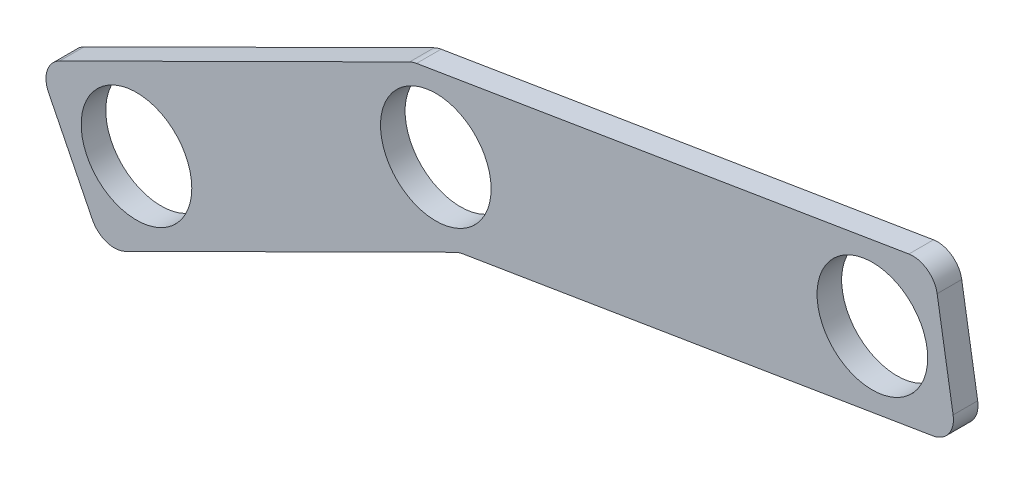
ISO-10303-21;
HEADER;
FILE_DESCRIPTION(('STEP AP214'),'2;1');
FILE_NAME('part.step','',(''),(''),'','','');
FILE_SCHEMA(('AUTOMOTIVE_DESIGN { 1 0 10303 214 1 1 1 1 }'));
ENDSEC;
DATA;
#1=APPLICATION_CONTEXT('core data for automotive mechanical design processes');
#2=APPLICATION_PROTOCOL_DEFINITION('international standard','automotive_design',2000,#1);
#3=PRODUCT_CONTEXT('',#1,'mechanical');
#4=PRODUCT('Part','Part','',(#3));
#5=PRODUCT_RELATED_PRODUCT_CATEGORY('part','',(#4));
#6=PRODUCT_DEFINITION_FORMATION('','',#4);
#7=PRODUCT_DEFINITION_CONTEXT('part definition',#1,'design');
#8=PRODUCT_DEFINITION('design','',#6,#7);
#9=PRODUCT_DEFINITION_SHAPE('','',#8);
#10=(LENGTH_UNIT() NAMED_UNIT(*) SI_UNIT(.MILLI.,.METRE.));
#11=(NAMED_UNIT(*) PLANE_ANGLE_UNIT() SI_UNIT($,.RADIAN.));
#12=(NAMED_UNIT(*) SI_UNIT($,.STERADIAN.) SOLID_ANGLE_UNIT());
#13=UNCERTAINTY_MEASURE_WITH_UNIT(LENGTH_MEASURE(1.E-05),#10,'distance_accuracy_value','');
#14=(GEOMETRIC_REPRESENTATION_CONTEXT(3) GLOBAL_UNCERTAINTY_ASSIGNED_CONTEXT((#13)) GLOBAL_UNIT_ASSIGNED_CONTEXT((#10,
#11,#12)) REPRESENTATION_CONTEXT('',''));
#15=CARTESIAN_POINT('',(0.,0.,0.));
#16=DIRECTION('',(0.,0.,1.));
#17=DIRECTION('',(1.,0.,0.));
#18=AXIS2_PLACEMENT_3D('',#15,#16,#17);
#19=CARTESIAN_POINT('',(-41.924554425237,254.568098691387,3.175));
#20=DIRECTION('',(0.162500000001426,-0.986708543593059,0.));
#21=DIRECTION('',(0.986708543593059,0.162500000001426,0.));
#22=AXIS2_PLACEMENT_3D('',#19,#20,#21);
#23=PLANE('',#22);
#24=DIRECTION('',(-0.98670854359306,-0.162500000001426,0.));
#25=VECTOR('',#24,1.);
#26=CARTESIAN_POINT('',(-41.924554425237,254.568098691387,-3.175));
#27=LINE('',#26,#25);
#28=CARTESIAN_POINT('',(678.196795385294,373.164132043968,-3.175));
#29=VERTEX_POINT('',#28);
#30=CARTESIAN_POINT('',(551.000523764214,352.216310853183,-3.175));
#31=VERTEX_POINT('',#30);
#32=EDGE_CURVE('E232',#29,#31,#27,.T.);
#33=ORIENTED_EDGE('',*,*,#32,.T.);
#34=DIRECTION('',(0.,0.,-1.));
#35=VECTOR('',#34,1.);
#36=CARTESIAN_POINT('',(551.000523764214,352.216310853183,3.175));
#37=LINE('',#36,#35);
#38=CARTESIAN_POINT('',(551.000523764214,352.216310853183,3.175));
#39=VERTEX_POINT('',#38);
#40=EDGE_CURVE('E201',#31,#39,#37,.F.);
#41=ORIENTED_EDGE('',*,*,#40,.T.);
#42=DIRECTION('',(-0.98670854359306,-0.162500000001426,0.));
#43=VECTOR('',#42,1.);
#44=CARTESIAN_POINT('',(-41.924554425237,254.568098691387,3.175));
#45=LINE('',#44,#43);
#46=CARTESIAN_POINT('',(678.196795385294,373.164132043968,3.175));
#47=VERTEX_POINT('',#46);
#48=EDGE_CURVE('E436',#47,#39,#45,.T.);
#49=ORIENTED_EDGE('',*,*,#48,.F.);
#50=DIRECTION('',(0.,0.,-1.));
#51=VECTOR('',#50,1.);
#52=CARTESIAN_POINT('',(678.196795385294,373.164132043968,3.175));
#53=LINE('',#52,#51);
#54=EDGE_CURVE('E198',#47,#29,#53,.T.);
#55=ORIENTED_EDGE('',*,*,#54,.T.);
#56=EDGE_LOOP('',(#33,#41,#49,#55));
#57=FACE_BOUND('',#56,.T.);
#58=ADVANCED_FACE('F39',(#57),#23,.F.);
#59=CARTESIAN_POINT('',(-31.2509469730069,62.8038273467465,3.175));
#60=DIRECTION('',(0.445491108516483,-0.895286363256335,0.));
#61=DIRECTION('',(0.895286363256335,0.445491108516483,0.));
#62=AXIS2_PLACEMENT_3D('',#59,#60,#61);
#63=PLANE('',#62);
#64=DIRECTION('',(-0.895286363256335,-0.445491108516483,0.));
#65=VECTOR('',#64,1.);
#66=CARTESIAN_POINT('',(-31.2509469730069,62.8038273467465,-3.175));
#67=LINE('',#66,#65);
#68=CARTESIAN_POINT('',(549.203530225143,351.635780008045,-3.175));
#69=VERTEX_POINT('',#68);
#70=CARTESIAN_POINT('',(458.798402644837,306.650530422831,-3.175));
#71=VERTEX_POINT('',#70);
#72=EDGE_CURVE('E235',#69,#71,#67,.T.);
#73=ORIENTED_EDGE('',*,*,#72,.T.);
#74=DIRECTION('',(0.,0.,-1.));
#75=VECTOR('',#74,1.);
#76=CARTESIAN_POINT('',(458.798402644837,306.650530422831,3.175));
#77=LINE('',#76,#75);
#78=CARTESIAN_POINT('',(458.798402644837,306.650530422831,3.175));
#79=VERTEX_POINT('',#78);
#80=EDGE_CURVE('E196',#71,#79,#77,.F.);
#81=ORIENTED_EDGE('',*,*,#80,.T.);
#82=DIRECTION('',(-0.895286363256335,-0.445491108516483,0.));
#83=VECTOR('',#82,1.);
#84=CARTESIAN_POINT('',(-31.2509469730069,62.8038273467465,3.175));
#85=LINE('',#84,#83);
#86=CARTESIAN_POINT('',(549.203530225143,351.635780008045,3.175));
#87=VERTEX_POINT('',#86);
#88=EDGE_CURVE('E439',#87,#79,#85,.T.);
#89=ORIENTED_EDGE('',*,*,#88,.F.);
#90=DIRECTION('',(0.,0.,-1.));
#91=VECTOR('',#90,1.);
#92=CARTESIAN_POINT('',(549.203530225143,351.635780008045,3.175));
#93=LINE('',#92,#91);
#94=EDGE_CURVE('E193',#87,#69,#93,.T.);
#95=ORIENTED_EDGE('',*,*,#94,.T.);
#96=EDGE_LOOP('',(#73,#81,#89,#95));
#97=FACE_BOUND('',#96,.T.);
#98=ADVANCED_FACE('F259',(#97),#63,.F.);
#99=CARTESIAN_POINT('',(484.364281211167,241.017834537005,3.175));
#100=DIRECTION('',(0.895286363256335,0.445491108516483,0.));
#101=DIRECTION('',(-0.445491108516483,0.895286363256336,0.));
#102=AXIS2_PLACEMENT_3D('',#99,#100,#101);
#103=PLANE('',#102);
#104=DIRECTION('',(0.445491108516483,-0.895286363256336,0.));
#105=VECTOR('',#104,1.);
#106=CARTESIAN_POINT('',(484.364281211167,241.017834537005,-3.175));
#107=LINE('',#106,#105);
#108=CARTESIAN_POINT('',(455.942202777239,298.136593477074,-3.175));
#109=VERTEX_POINT('',#108);
#110=CARTESIAN_POINT('',(467.257676933558,275.396319850363,-3.175));
#111=VERTEX_POINT('',#110);
#112=EDGE_CURVE('E207',#109,#111,#107,.T.);
#113=ORIENTED_EDGE('',*,*,#112,.T.);
#114=DIRECTION('',(0.,0.,-1.));
#115=VECTOR('',#114,1.);
#116=CARTESIAN_POINT('',(467.257676933558,275.396319850363,3.175));
#117=LINE('',#116,#115);
#118=CARTESIAN_POINT('',(467.257676933558,275.396319850363,3.175));
#119=VERTEX_POINT('',#118);
#120=EDGE_CURVE('E191',#111,#119,#117,.F.);
#121=ORIENTED_EDGE('',*,*,#120,.T.);
#122=DIRECTION('',(0.445491108516483,-0.895286363256336,0.));
#123=VECTOR('',#122,1.);
#124=CARTESIAN_POINT('',(484.364281211167,241.017834537005,3.175));
#125=LINE('',#124,#123);
#126=CARTESIAN_POINT('',(455.942202777239,298.136593477074,3.175));
#127=VERTEX_POINT('',#126);
#128=EDGE_CURVE('E219',#127,#119,#125,.T.);
#129=ORIENTED_EDGE('',*,*,#128,.F.);
#130=DIRECTION('',(0.,0.,-1.));
#131=VECTOR('',#130,1.);
#132=CARTESIAN_POINT('',(455.942202777239,298.136593477074,3.175));
#133=LINE('',#132,#131);
#134=EDGE_CURVE('E188',#127,#109,#133,.T.);
#135=ORIENTED_EDGE('',*,*,#134,.T.);
#136=EDGE_LOOP('',(#113,#121,#129,#135));
#137=FACE_BOUND('',#136,.T.);
#138=ADVANCED_FACE('F242',(#137),#103,.F.);
#139=CARTESIAN_POINT('',(-14.2777357385289,28.6934169066803,3.175));
#140=DIRECTION('',(-0.445491108516483,0.895286363256335,0.));
#141=DIRECTION('',(-0.895286363256335,-0.445491108516483,0.));
#142=AXIS2_PLACEMENT_3D('',#139,#140,#141);
#143=PLANE('',#142);
#144=DIRECTION('',(0.895286363256336,0.445491108516483,0.));
#145=VECTOR('',#144,1.);
#146=CARTESIAN_POINT('',(-14.2777357385289,28.6934169066803,-3.175));
#147=LINE('',#146,#145);
#148=CARTESIAN_POINT('',(475.771613879315,272.540119982765,-3.175));
#149=VERTEX_POINT('',#148);
#150=CARTESIAN_POINT('',(561.047639979481,314.973148068959,-3.175));
#151=VERTEX_POINT('',#150);
#152=EDGE_CURVE('E161',#149,#151,#147,.T.);
#153=ORIENTED_EDGE('',*,*,#152,.T.);
#154=DIRECTION('',(0.,0.,-1.));
#155=VECTOR('',#154,1.);
#156=CARTESIAN_POINT('',(561.047639979481,314.973148068959,3.175));
#157=LINE('',#156,#155);
#158=CARTESIAN_POINT('',(561.047639979481,314.973148068959,3.175));
#159=VERTEX_POINT('',#158);
#160=EDGE_CURVE('E54',#151,#159,#157,.F.);
#161=ORIENTED_EDGE('',*,*,#160,.T.);
#162=DIRECTION('',(0.895286363256336,0.445491108516483,0.));
#163=VECTOR('',#162,1.);
#164=CARTESIAN_POINT('',(-14.2777357385289,28.6934169066803,3.175));
#165=LINE('',#164,#163);
#166=CARTESIAN_POINT('',(475.771613879315,272.540119982765,3.175));
#167=VERTEX_POINT('',#166);
#168=EDGE_CURVE('E214',#167,#159,#165,.T.);
#169=ORIENTED_EDGE('',*,*,#168,.F.);
#170=DIRECTION('',(0.,0.,-1.));
#171=VECTOR('',#170,1.);
#172=CARTESIAN_POINT('',(475.771613879315,272.540119982765,3.175));
#173=LINE('',#172,#171);
#174=EDGE_CURVE('E184',#167,#149,#173,.T.);
#175=ORIENTED_EDGE('',*,*,#174,.T.);
#176=EDGE_LOOP('',(#153,#161,#169,#175));
#177=FACE_BOUND('',#176,.T.);
#178=ADVANCED_FACE('F205',(#177),#143,.F.);
#179=CARTESIAN_POINT('',(-35.7333044251826,216.974503180492,3.175));
#180=DIRECTION('',(-0.162500000001426,0.986708543593059,0.));
#181=DIRECTION('',(-0.98670854359306,-0.162500000001426,0.));
#182=AXIS2_PLACEMENT_3D('',#179,#180,#181);
#183=PLANE('',#182);
#184=DIRECTION('',(0.986708543593059,0.162500000001426,0.));
#185=VECTOR('',#184,1.);
#186=CARTESIAN_POINT('',(-35.7333044251826,216.974503180492,-3.175));
#187=LINE('',#186,#185);
#188=CARTESIAN_POINT('',(562.844633518552,315.553678914098,-3.175));
#189=VERTEX_POINT('',#188);
#190=CARTESIAN_POINT('',(684.388045385348,335.570536533072,-3.175));
#191=VERTEX_POINT('',#190);
#192=EDGE_CURVE('E156',#189,#191,#187,.T.);
#193=ORIENTED_EDGE('',*,*,#192,.T.);
#194=DIRECTION('',(0.,0.,-1.));
#195=VECTOR('',#194,1.);
#196=CARTESIAN_POINT('',(684.388045385348,335.570536533072,3.175));
#197=LINE('',#196,#195);
#198=CARTESIAN_POINT('',(684.388045385348,335.570536533072,3.175));
#199=VERTEX_POINT('',#198);
#200=EDGE_CURVE('E134',#191,#199,#197,.F.);
#201=ORIENTED_EDGE('',*,*,#200,.T.);
#202=DIRECTION('',(0.986708543593059,0.162500000001426,0.));
#203=VECTOR('',#202,1.);
#204=CARTESIAN_POINT('',(-35.7333044251826,216.974503180492,3.175));
#205=LINE('',#204,#203);
#206=CARTESIAN_POINT('',(562.844633518552,315.553678914098,3.175));
#207=VERTEX_POINT('',#206);
#208=EDGE_CURVE('E213',#207,#199,#205,.T.);
#209=ORIENTED_EDGE('',*,*,#208,.F.);
#210=DIRECTION('',(0.,0.,-1.));
#211=VECTOR('',#210,1.);
#212=CARTESIAN_POINT('',(562.844633518551,315.553678914098,-3.175));
#213=LINE('',#212,#211);
#214=EDGE_CURVE('E139',#207,#189,#213,.T.);
#215=ORIENTED_EDGE('',*,*,#214,.T.);
#216=EDGE_LOOP('',(#193,#201,#209,#215));
#217=FACE_BOUND('',#216,.T.);
#218=ADVANCED_FACE('F216',(#217),#183,.F.);
#219=CARTESIAN_POINT('',(668.761221881689,352.303584288502,3.175));
#220=DIRECTION('',(0.,0.,-1.));
#221=DIRECTION('',(-1.,0.,0.));
#222=AXIS2_PLACEMENT_3D('',#219,#220,#221);
#223=CYLINDRICAL_SURFACE('',#222,14.2875);
#224=CARTESIAN_POINT('',(668.761221881689,352.303584288502,3.175));
#225=DIRECTION('',(0.,0.,1.));
#226=DIRECTION('',(1.,0.,0.));
#227=AXIS2_PLACEMENT_3D('',#224,#225,#226);
#228=CIRCLE('',#227,14.2875);
#229=CARTESIAN_POINT('',(683.048721881689,352.303584288502,3.175));
#230=VERTEX_POINT('',#229);
#231=EDGE_CURVE('E440',#230,#230,#228,.T.);
#232=ORIENTED_EDGE('',*,*,#231,.T.);
#233=EDGE_LOOP('',(#232));
#234=FACE_BOUND('',#233,.T.);
#235=CARTESIAN_POINT('',(668.761221881689,352.303584288502,-3.175));
#236=DIRECTION('',(0.,0.,1.));
#237=DIRECTION('',(1.,0.,0.));
#238=AXIS2_PLACEMENT_3D('',#235,#236,#237);
#239=CIRCLE('',#238,14.2875);
#240=CARTESIAN_POINT('',(683.048721881689,352.303584288502,-3.175));
#241=VERTEX_POINT('',#240);
#242=EDGE_CURVE('E229',#241,#241,#239,.T.);
#243=ORIENTED_EDGE('',*,*,#242,.F.);
#244=EDGE_LOOP('',(#243));
#245=FACE_BOUND('',#244,.T.);
#246=ADVANCED_FACE('F269',(#234,#245),#223,.F.);
#247=CARTESIAN_POINT('',(555.980435349002,333.729834288339,3.175));
#248=DIRECTION('',(0.,0.,-1.));
#249=DIRECTION('',(-1.,0.,0.));
#250=AXIS2_PLACEMENT_3D('',#247,#248,#249);
#251=CYLINDRICAL_SURFACE('',#250,14.2875);
#252=CARTESIAN_POINT('',(555.980435349002,333.729834288339,3.175));
#253=DIRECTION('',(0.,0.,1.));
#254=DIRECTION('',(1.,0.,0.));
#255=AXIS2_PLACEMENT_3D('',#252,#253,#254);
#256=CIRCLE('',#255,14.2875);
#257=CARTESIAN_POINT('',(570.267935349002,333.729834288339,3.175));
#258=VERTEX_POINT('',#257);
#259=EDGE_CURVE('E159',#258,#258,#256,.T.);
#260=ORIENTED_EDGE('',*,*,#259,.T.);
#261=EDGE_LOOP('',(#260));
#262=FACE_BOUND('',#261,.T.);
#263=CARTESIAN_POINT('',(555.980435349002,333.729834288339,-3.175));
#264=DIRECTION('',(0.,0.,1.));
#265=DIRECTION('',(1.,0.,0.));
#266=AXIS2_PLACEMENT_3D('',#263,#264,#265);
#267=CIRCLE('',#266,14.2875);
#268=CARTESIAN_POINT('',(570.267935349002,333.729834288339,-3.175));
#269=VERTEX_POINT('',#268);
#270=EDGE_CURVE('E226',#269,#269,#267,.T.);
#271=ORIENTED_EDGE('',*,*,#270,.F.);
#272=EDGE_LOOP('',(#271));
#273=FACE_BOUND('',#272,.T.);
#274=ADVANCED_FACE('F272',(#262,#273),#251,.F.);
#275=CARTESIAN_POINT('',(478.655145075432,295.253062280957,3.175));
#276=DIRECTION('',(0.,0.,-1.));
#277=DIRECTION('',(-1.,0.,0.));
#278=AXIS2_PLACEMENT_3D('',#275,#276,#277);
#279=CYLINDRICAL_SURFACE('',#278,14.2875);
#280=CARTESIAN_POINT('',(478.655145075432,295.253062280957,3.175));
#281=DIRECTION('',(0.,0.,1.));
#282=DIRECTION('',(1.,0.,0.));
#283=AXIS2_PLACEMENT_3D('',#280,#281,#282);
#284=CIRCLE('',#283,14.2875);
#285=CARTESIAN_POINT('',(492.942645075432,295.253062280957,3.175));
#286=VERTEX_POINT('',#285);
#287=EDGE_CURVE('E155',#286,#286,#284,.T.);
#288=ORIENTED_EDGE('',*,*,#287,.T.);
#289=EDGE_LOOP('',(#288));
#290=FACE_BOUND('',#289,.T.);
#291=CARTESIAN_POINT('',(478.655145075432,295.253062280957,-3.175));
#292=DIRECTION('',(0.,0.,1.));
#293=DIRECTION('',(1.,0.,0.));
#294=AXIS2_PLACEMENT_3D('',#291,#292,#293);
#295=CIRCLE('',#294,14.2875);
#296=CARTESIAN_POINT('',(492.942645075432,295.253062280957,-3.175));
#297=VERTEX_POINT('',#296);
#298=EDGE_CURVE('E223',#297,#297,#295,.T.);
#299=ORIENTED_EDGE('',*,*,#298,.F.);
#300=EDGE_LOOP('',(#299));
#301=FACE_BOUND('',#300,.T.);
#302=ADVANCED_FACE('F276',(#290,#301),#279,.F.);
#303=CARTESIAN_POINT('',(726.386949062347,119.62790835259,3.175));
#304=DIRECTION('',(-0.986708543593059,-0.162500000001427,0.));
#305=DIRECTION('',(0.162500000001427,-0.986708543593059,0.));
#306=AXIS2_PLACEMENT_3D('',#303,#304,#305);
#307=PLANE('',#306);
#308=DIRECTION('',(-0.162500000001427,0.986708543593059,0.));
#309=VECTOR('',#308,1.);
#310=CARTESIAN_POINT('',(726.386949062347,119.62790835259,3.175));
#311=LINE('',#310,#309);
#312=CARTESIAN_POINT('',(689.621769637155,342.868010784897,3.175));
#313=VERTEX_POINT('',#312);
#314=CARTESIAN_POINT('',(685.494269637119,367.930407792161,3.175));
#315=VERTEX_POINT('',#314);
#316=EDGE_CURVE('E149',#313,#315,#311,.T.);
#317=ORIENTED_EDGE('',*,*,#316,.F.);
#318=DIRECTION('',(0.,0.,-1.));
#319=VECTOR('',#318,1.);
#320=CARTESIAN_POINT('',(689.621769637155,342.868010784897,3.175));
#321=LINE('',#320,#319);
#322=CARTESIAN_POINT('',(689.621769637155,342.868010784897,-3.175));
#323=VERTEX_POINT('',#322);
#324=EDGE_CURVE('E133',#313,#323,#321,.T.);
#325=ORIENTED_EDGE('',*,*,#324,.T.);
#326=DIRECTION('',(-0.162500000001427,0.986708543593059,0.));
#327=VECTOR('',#326,1.);
#328=CARTESIAN_POINT('',(726.386949062347,119.62790835259,-3.175));
#329=LINE('',#328,#327);
#330=CARTESIAN_POINT('',(685.494269637119,367.930407792161,-3.175));
#331=VERTEX_POINT('',#330);
#332=EDGE_CURVE('E146',#323,#331,#329,.T.);
#333=ORIENTED_EDGE('',*,*,#332,.T.);
#334=DIRECTION('',(0.,0.,-1.));
#335=VECTOR('',#334,1.);
#336=CARTESIAN_POINT('',(685.494269637119,367.930407792161,3.175));
#337=LINE('',#336,#335);
#338=EDGE_CURVE('E151',#331,#315,#337,.F.);
#339=ORIENTED_EDGE('',*,*,#338,.T.);
#340=EDGE_LOOP('',(#317,#325,#333,#339));
#341=FACE_BOUND('',#340,.T.);
#342=ADVANCED_FACE('F145',(#341),#307,.F.);
#343=CARTESIAN_POINT('',(0.,0.,3.175));
#344=DIRECTION('',(0.,0.,1.));
#345=DIRECTION('',(1.,0.,0.));
#346=AXIS2_PLACEMENT_3D('',#343,#344,#345);
#347=PLANE('',#346);
#348=ORIENTED_EDGE('',*,*,#287,.F.);
#349=EDGE_LOOP('',(#348));
#350=FACE_BOUND('',#349,.T.);
#351=ORIENTED_EDGE('',*,*,#259,.F.);
#352=EDGE_LOOP('',(#351));
#353=FACE_BOUND('',#352,.T.);
#354=ORIENTED_EDGE('',*,*,#231,.F.);
#355=EDGE_LOOP('',(#354));
#356=FACE_BOUND('',#355,.T.);
#357=ORIENTED_EDGE('',*,*,#208,.T.);
#358=CARTESIAN_POINT('',(683.356170385339,341.836135784888,3.175));
#359=DIRECTION('',(0.,0.,1.));
#360=DIRECTION('',(1.,0.,0.));
#361=AXIS2_PLACEMENT_3D('',#358,#359,#360);
#362=CIRCLE('',#361,6.35);
#363=EDGE_CURVE('E182',#199,#313,#362,.T.);
#364=ORIENTED_EDGE('',*,*,#363,.T.);
#365=ORIENTED_EDGE('',*,*,#316,.T.);
#366=CARTESIAN_POINT('',(679.228670385303,366.898532792152,3.175));
#367=DIRECTION('',(0.,0.,1.));
#368=DIRECTION('',(1.,0.,0.));
#369=AXIS2_PLACEMENT_3D('',#366,#367,#368);
#370=CIRCLE('',#369,6.35);
#371=EDGE_CURVE('E175',#315,#47,#370,.T.);
#372=ORIENTED_EDGE('',*,*,#371,.T.);
#373=ORIENTED_EDGE('',*,*,#48,.T.);
#374=CARTESIAN_POINT('',(552.032398764223,345.950711601367,3.175));
#375=DIRECTION('',(0.,0.,1.));
#376=DIRECTION('',(1.,0.,0.));
#377=AXIS2_PLACEMENT_3D('',#374,#375,#376);
#378=CIRCLE('',#377,6.35);
#379=EDGE_CURVE('E177',#39,#87,#378,.T.);
#380=ORIENTED_EDGE('',*,*,#379,.T.);
#381=ORIENTED_EDGE('',*,*,#88,.T.);
#382=CARTESIAN_POINT('',(461.627271183917,300.965462016153,3.175));
#383=DIRECTION('',(0.,0.,1.));
#384=DIRECTION('',(1.,0.,0.));
#385=AXIS2_PLACEMENT_3D('',#382,#383,#384);
#386=CIRCLE('',#385,6.35);
#387=EDGE_CURVE('E179',#79,#127,#386,.T.);
#388=ORIENTED_EDGE('',*,*,#387,.T.);
#389=ORIENTED_EDGE('',*,*,#128,.T.);
#390=CARTESIAN_POINT('',(472.942745340236,278.225188389442,3.175));
#391=DIRECTION('',(0.,0.,1.));
#392=DIRECTION('',(1.,0.,0.));
#393=AXIS2_PLACEMENT_3D('',#390,#391,#392);
#394=CIRCLE('',#393,6.35);
#395=EDGE_CURVE('E61',#119,#167,#394,.T.);
#396=ORIENTED_EDGE('',*,*,#395,.T.);
#397=ORIENTED_EDGE('',*,*,#168,.T.);
#398=CARTESIAN_POINT('',(563.87650851856,309.288079662282,3.175));
#399=DIRECTION('',(0.,0.,1.));
#400=DIRECTION('',(1.,0.,0.));
#401=AXIS2_PLACEMENT_3D('',#398,#399,#400);
#402=CIRCLE('',#401,6.35);
#403=EDGE_CURVE('E11',#159,#207,#402,.F.);
#404=ORIENTED_EDGE('',*,*,#403,.T.);
#405=EDGE_LOOP('',(#357,#364,#365,#372,#373,#380,#381,#388,#389,#396,#397,#404));
#406=FACE_BOUND('',#405,.T.);
#407=ADVANCED_FACE('F212',(#350,#353,#356,#406),#347,.T.);
#408=CARTESIAN_POINT('',(0.,0.,-3.175));
#409=DIRECTION('',(0.,0.,1.));
#410=DIRECTION('',(1.,0.,0.));
#411=AXIS2_PLACEMENT_3D('',#408,#409,#410);
#412=PLANE('',#411);
#413=ORIENTED_EDGE('',*,*,#298,.T.);
#414=EDGE_LOOP('',(#413));
#415=FACE_BOUND('',#414,.T.);
#416=ORIENTED_EDGE('',*,*,#270,.T.);
#417=EDGE_LOOP('',(#416));
#418=FACE_BOUND('',#417,.T.);
#419=ORIENTED_EDGE('',*,*,#242,.T.);
#420=EDGE_LOOP('',(#419));
#421=FACE_BOUND('',#420,.T.);
#422=ORIENTED_EDGE('',*,*,#332,.F.);
#423=CARTESIAN_POINT('',(683.356170385339,341.836135784888,-3.175));
#424=DIRECTION('',(0.,0.,1.));
#425=DIRECTION('',(1.,0.,0.));
#426=AXIS2_PLACEMENT_3D('',#423,#424,#425);
#427=CIRCLE('',#426,6.35);
#428=EDGE_CURVE('E129',#323,#191,#427,.F.);
#429=ORIENTED_EDGE('',*,*,#428,.T.);
#430=ORIENTED_EDGE('',*,*,#192,.F.);
#431=CARTESIAN_POINT('',(563.87650851856,309.288079662282,-3.175));
#432=DIRECTION('',(0.,0.,1.));
#433=DIRECTION('',(1.,0.,0.));
#434=AXIS2_PLACEMENT_3D('',#431,#432,#433);
#435=CIRCLE('',#434,6.35);
#436=EDGE_CURVE('E47',#189,#151,#435,.T.);
#437=ORIENTED_EDGE('',*,*,#436,.T.);
#438=ORIENTED_EDGE('',*,*,#152,.F.);
#439=CARTESIAN_POINT('',(472.942745340236,278.225188389442,-3.175));
#440=DIRECTION('',(0.,0.,1.));
#441=DIRECTION('',(1.,0.,0.));
#442=AXIS2_PLACEMENT_3D('',#439,#440,#441);
#443=CIRCLE('',#442,6.35);
#444=EDGE_CURVE('E140',#149,#111,#443,.F.);
#445=ORIENTED_EDGE('',*,*,#444,.T.);
#446=ORIENTED_EDGE('',*,*,#112,.F.);
#447=CARTESIAN_POINT('',(461.627271183917,300.965462016153,-3.175));
#448=DIRECTION('',(0.,0.,1.));
#449=DIRECTION('',(1.,0.,0.));
#450=AXIS2_PLACEMENT_3D('',#447,#448,#449);
#451=CIRCLE('',#450,6.35);
#452=EDGE_CURVE('E169',#109,#71,#451,.F.);
#453=ORIENTED_EDGE('',*,*,#452,.T.);
#454=ORIENTED_EDGE('',*,*,#72,.F.);
#455=CARTESIAN_POINT('',(552.032398764223,345.950711601367,-3.175));
#456=DIRECTION('',(0.,0.,1.));
#457=DIRECTION('',(1.,0.,0.));
#458=AXIS2_PLACEMENT_3D('',#455,#456,#457);
#459=CIRCLE('',#458,6.35);
#460=EDGE_CURVE('E167',#69,#31,#459,.F.);
#461=ORIENTED_EDGE('',*,*,#460,.T.);
#462=ORIENTED_EDGE('',*,*,#32,.F.);
#463=CARTESIAN_POINT('',(679.228670385303,366.898532792152,-3.175));
#464=DIRECTION('',(0.,0.,1.));
#465=DIRECTION('',(1.,0.,0.));
#466=AXIS2_PLACEMENT_3D('',#463,#464,#465);
#467=CIRCLE('',#466,6.35);
#468=EDGE_CURVE('E150',#29,#331,#467,.F.);
#469=ORIENTED_EDGE('',*,*,#468,.T.);
#470=EDGE_LOOP('',(#422,#429,#430,#437,#438,#445,#446,#453,#454,#461,#462,#469));
#471=FACE_BOUND('',#470,.T.);
#472=ADVANCED_FACE('F153',(#415,#418,#421,#471),#412,.F.);
#473=CARTESIAN_POINT('',(683.356170385339,341.836135784888,3.175));
#474=DIRECTION('',(0.,0.,-1.));
#475=DIRECTION('',(-1.,0.,0.));
#476=AXIS2_PLACEMENT_3D('',#473,#474,#475);
#477=CYLINDRICAL_SURFACE('',#476,6.35);
#478=ORIENTED_EDGE('',*,*,#363,.F.);
#479=ORIENTED_EDGE('',*,*,#200,.F.);
#480=ORIENTED_EDGE('',*,*,#428,.F.);
#481=ORIENTED_EDGE('',*,*,#324,.F.);
#482=EDGE_LOOP('',(#478,#479,#480,#481));
#483=FACE_BOUND('',#482,.T.);
#484=ADVANCED_FACE('F132',(#483),#477,.T.);
#485=CARTESIAN_POINT('',(563.87650851856,309.288079662282,3.175));
#486=DIRECTION('',(0.,0.,1.));
#487=DIRECTION('',(1.,0.,0.));
#488=AXIS2_PLACEMENT_3D('',#485,#486,#487);
#489=CYLINDRICAL_SURFACE('',#488,6.35);
#490=ORIENTED_EDGE('',*,*,#403,.F.);
#491=ORIENTED_EDGE('',*,*,#160,.F.);
#492=ORIENTED_EDGE('',*,*,#436,.F.);
#493=ORIENTED_EDGE('',*,*,#214,.F.);
#494=EDGE_LOOP('',(#490,#491,#492,#493));
#495=FACE_BOUND('',#494,.T.);
#496=ADVANCED_FACE('F209',(#495),#489,.F.);
#497=CARTESIAN_POINT('',(472.942745340236,278.225188389442,3.175));
#498=DIRECTION('',(0.,0.,-1.));
#499=DIRECTION('',(-1.,0.,0.));
#500=AXIS2_PLACEMENT_3D('',#497,#498,#499);
#501=CYLINDRICAL_SURFACE('',#500,6.35);
#502=ORIENTED_EDGE('',*,*,#395,.F.);
#503=ORIENTED_EDGE('',*,*,#120,.F.);
#504=ORIENTED_EDGE('',*,*,#444,.F.);
#505=ORIENTED_EDGE('',*,*,#174,.F.);
#506=EDGE_LOOP('',(#502,#503,#504,#505));
#507=FACE_BOUND('',#506,.T.);
#508=ADVANCED_FACE('F246',(#507),#501,.T.);
#509=CARTESIAN_POINT('',(461.627271183917,300.965462016153,3.175));
#510=DIRECTION('',(0.,0.,-1.));
#511=DIRECTION('',(-1.,0.,0.));
#512=AXIS2_PLACEMENT_3D('',#509,#510,#511);
#513=CYLINDRICAL_SURFACE('',#512,6.35);
#514=ORIENTED_EDGE('',*,*,#387,.F.);
#515=ORIENTED_EDGE('',*,*,#80,.F.);
#516=ORIENTED_EDGE('',*,*,#452,.F.);
#517=ORIENTED_EDGE('',*,*,#134,.F.);
#518=EDGE_LOOP('',(#514,#515,#516,#517));
#519=FACE_BOUND('',#518,.T.);
#520=ADVANCED_FACE('F248',(#519),#513,.T.);
#521=CARTESIAN_POINT('',(552.032398764223,345.950711601367,3.175));
#522=DIRECTION('',(0.,0.,-1.));
#523=DIRECTION('',(-1.,0.,0.));
#524=AXIS2_PLACEMENT_3D('',#521,#522,#523);
#525=CYLINDRICAL_SURFACE('',#524,6.35);
#526=ORIENTED_EDGE('',*,*,#379,.F.);
#527=ORIENTED_EDGE('',*,*,#40,.F.);
#528=ORIENTED_EDGE('',*,*,#460,.F.);
#529=ORIENTED_EDGE('',*,*,#94,.F.);
#530=EDGE_LOOP('',(#526,#527,#528,#529));
#531=FACE_BOUND('',#530,.T.);
#532=ADVANCED_FACE('F254',(#531),#525,.T.);
#533=CARTESIAN_POINT('',(679.228670385303,366.898532792152,3.175));
#534=DIRECTION('',(0.,0.,-1.));
#535=DIRECTION('',(-1.,0.,0.));
#536=AXIS2_PLACEMENT_3D('',#533,#534,#535);
#537=CYLINDRICAL_SURFACE('',#536,6.35);
#538=ORIENTED_EDGE('',*,*,#371,.F.);
#539=ORIENTED_EDGE('',*,*,#338,.F.);
#540=ORIENTED_EDGE('',*,*,#468,.F.);
#541=ORIENTED_EDGE('',*,*,#54,.F.);
#542=EDGE_LOOP('',(#538,#539,#540,#541));
#543=FACE_BOUND('',#542,.T.);
#544=ADVANCED_FACE('F41',(#543),#537,.T.);
#545=CLOSED_SHELL('',(#58,#98,#138,#178,#218,#246,#274,#302,#342,#407,#472,#484,#496,#508,#520,
#532,#544));
#546=MANIFOLD_SOLID_BREP('B2',#545);
#547=ADVANCED_BREP_SHAPE_REPRESENTATION('',(#18,#546),#14);
#548=SHAPE_DEFINITION_REPRESENTATION(#9,#547);
ENDSEC;
END-ISO-10303-21;
